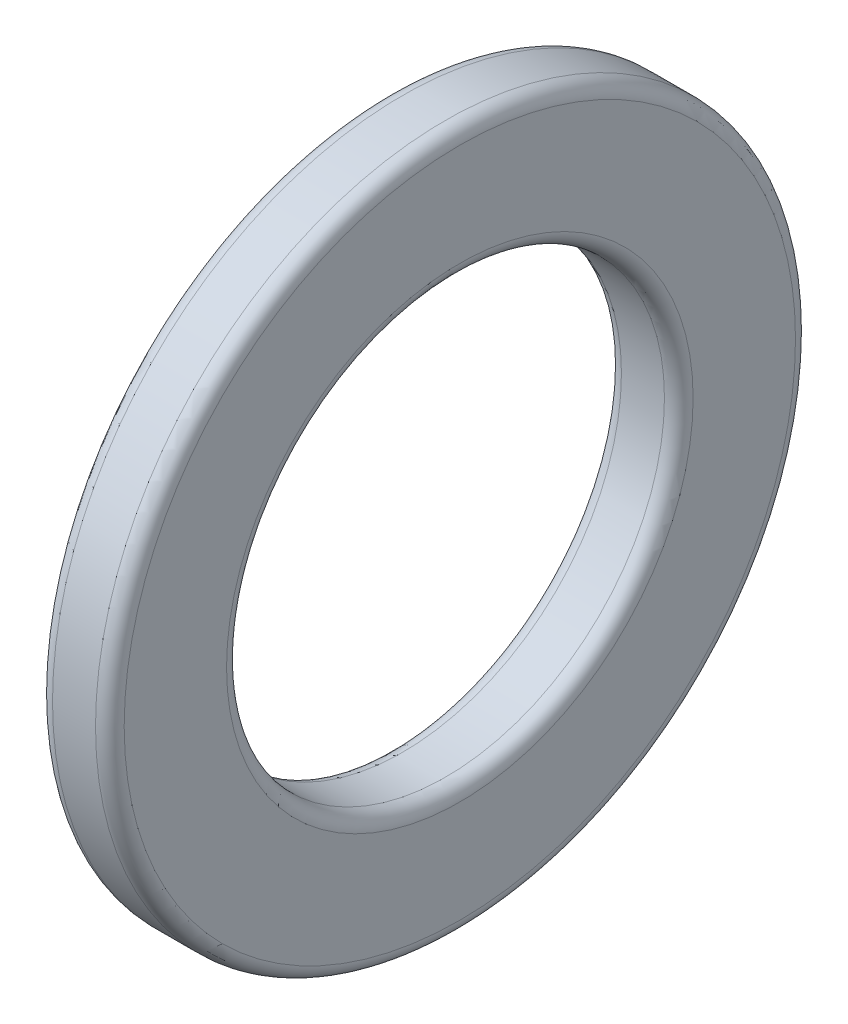
ISO-10303-21;
HEADER;
FILE_DESCRIPTION(('STEP AP214'),'2;1');
FILE_NAME('part.step','',(''),(''),'','','');
FILE_SCHEMA(('AUTOMOTIVE_DESIGN { 1 0 10303 214 1 1 1 1 }'));
ENDSEC;
DATA;
#1=APPLICATION_CONTEXT('core data for automotive mechanical design processes');
#2=APPLICATION_PROTOCOL_DEFINITION('international standard','automotive_design',2000,#1);
#3=PRODUCT_CONTEXT('',#1,'mechanical');
#4=PRODUCT('Part','Part','',(#3));
#5=PRODUCT_RELATED_PRODUCT_CATEGORY('part','',(#4));
#6=PRODUCT_DEFINITION_FORMATION('','',#4);
#7=PRODUCT_DEFINITION_CONTEXT('part definition',#1,'design');
#8=PRODUCT_DEFINITION('design','',#6,#7);
#9=PRODUCT_DEFINITION_SHAPE('','',#8);
#10=(LENGTH_UNIT() NAMED_UNIT(*) SI_UNIT(.MILLI.,.METRE.));
#11=(NAMED_UNIT(*) PLANE_ANGLE_UNIT() SI_UNIT($,.RADIAN.));
#12=(NAMED_UNIT(*) SI_UNIT($,.STERADIAN.) SOLID_ANGLE_UNIT());
#13=UNCERTAINTY_MEASURE_WITH_UNIT(LENGTH_MEASURE(1.E-05),#10,'distance_accuracy_value','');
#14=(GEOMETRIC_REPRESENTATION_CONTEXT(3) GLOBAL_UNCERTAINTY_ASSIGNED_CONTEXT((#13)) GLOBAL_UNIT_ASSIGNED_CONTEXT((#10,
#11,#12)) REPRESENTATION_CONTEXT('',''));
#15=CARTESIAN_POINT('',(0.,0.,0.));
#16=DIRECTION('',(0.,0.,1.));
#17=DIRECTION('',(1.,0.,0.));
#18=AXIS2_PLACEMENT_3D('',#15,#16,#17);
#19=CARTESIAN_POINT('',(0.8128,0.,0.));
#20=DIRECTION('',(1.,0.,0.));
#21=DIRECTION('',(0.,0.,-1.));
#22=AXIS2_PLACEMENT_3D('',#19,#20,#21);
#23=PLANE('',#22);
#24=CARTESIAN_POINT('',(0.8128,0.,0.));
#25=DIRECTION('',(1.,0.,0.));
#26=DIRECTION('',(0.,0.,-1.));
#27=AXIS2_PLACEMENT_3D('',#24,#25,#26);
#28=CIRCLE('',#27,7.61237999999999);
#29=CARTESIAN_POINT('',(0.8128,0.,-7.61237999999999));
#30=VERTEX_POINT('',#29);
#31=EDGE_CURVE('E80',#30,#30,#28,.T.);
#32=ORIENTED_EDGE('',*,*,#31,.T.);
#33=EDGE_LOOP('',(#32));
#34=FACE_BOUND('',#33,.T.);
#35=CARTESIAN_POINT('',(0.8128,0.,0.));
#36=DIRECTION('',(1.,0.,0.));
#37=DIRECTION('',(0.,0.,-1.));
#38=AXIS2_PLACEMENT_3D('',#35,#36,#37);
#39=CIRCLE('',#38,5.29082);
#40=CARTESIAN_POINT('',(0.8128,0.,-5.29082));
#41=VERTEX_POINT('',#40);
#42=EDGE_CURVE('E84',#41,#41,#39,.F.);
#43=ORIENTED_EDGE('',*,*,#42,.T.);
#44=EDGE_LOOP('',(#43));
#45=FACE_BOUND('',#44,.T.);
#46=ADVANCED_FACE('F45',(#34,#45),#23,.T.);
#47=CARTESIAN_POINT('',(-0.8128,0.,0.));
#48=DIRECTION('',(1.,0.,0.));
#49=DIRECTION('',(0.,0.,-1.));
#50=AXIS2_PLACEMENT_3D('',#47,#48,#49);
#51=PLANE('',#50);
#52=CARTESIAN_POINT('',(-0.8128,0.,0.));
#53=DIRECTION('',(1.,0.,0.));
#54=DIRECTION('',(0.,0.,-1.));
#55=AXIS2_PLACEMENT_3D('',#52,#53,#54);
#56=CIRCLE('',#55,7.61237999999999);
#57=CARTESIAN_POINT('',(-0.8128,0.,-7.61237999999999));
#58=VERTEX_POINT('',#57);
#59=EDGE_CURVE('E61',#58,#58,#56,.F.);
#60=ORIENTED_EDGE('',*,*,#59,.T.);
#61=EDGE_LOOP('',(#60));
#62=FACE_BOUND('',#61,.T.);
#63=CARTESIAN_POINT('',(-0.8128,0.,0.));
#64=DIRECTION('',(1.,0.,0.));
#65=DIRECTION('',(0.,0.,-1.));
#66=AXIS2_PLACEMENT_3D('',#63,#64,#65);
#67=CIRCLE('',#66,5.29082);
#68=CARTESIAN_POINT('',(-0.8128,0.,-5.29082));
#69=VERTEX_POINT('',#68);
#70=EDGE_CURVE('E68',#69,#69,#67,.T.);
#71=ORIENTED_EDGE('',*,*,#70,.T.);
#72=EDGE_LOOP('',(#71));
#73=FACE_BOUND('',#72,.T.);
#74=ADVANCED_FACE('F103',(#62,#73),#51,.F.);
#75=CARTESIAN_POINT('',(0.8128,0.,0.));
#76=DIRECTION('',(-1.,0.,0.));
#77=DIRECTION('',(0.,0.,1.));
#78=AXIS2_PLACEMENT_3D('',#75,#76,#77);
#79=CYLINDRICAL_SURFACE('',#78,7.93749999999999);
#80=CARTESIAN_POINT('',(0.48768,0.,0.));
#81=DIRECTION('',(1.,0.,0.));
#82=DIRECTION('',(0.,0.,-1.));
#83=AXIS2_PLACEMENT_3D('',#80,#81,#82);
#84=CIRCLE('',#83,7.93749999999999);
#85=CARTESIAN_POINT('',(0.48768,0.,-7.93749999999999));
#86=VERTEX_POINT('',#85);
#87=EDGE_CURVE('E73',#86,#86,#84,.F.);
#88=ORIENTED_EDGE('',*,*,#87,.T.);
#89=EDGE_LOOP('',(#88));
#90=FACE_BOUND('',#89,.T.);
#91=CARTESIAN_POINT('',(-0.48768,0.,0.));
#92=DIRECTION('',(1.,0.,0.));
#93=DIRECTION('',(0.,0.,-1.));
#94=AXIS2_PLACEMENT_3D('',#91,#92,#93);
#95=CIRCLE('',#94,7.93749999999999);
#96=CARTESIAN_POINT('',(-0.48768,0.,-7.93749999999999));
#97=VERTEX_POINT('',#96);
#98=EDGE_CURVE('E77',#97,#97,#95,.T.);
#99=ORIENTED_EDGE('',*,*,#98,.T.);
#100=EDGE_LOOP('',(#99));
#101=FACE_BOUND('',#100,.T.);
#102=ADVANCED_FACE('F108',(#90,#101),#79,.T.);
#103=CARTESIAN_POINT('',(0.8128,0.,0.));
#104=DIRECTION('',(-1.,0.,0.));
#105=DIRECTION('',(0.,0.,1.));
#106=AXIS2_PLACEMENT_3D('',#103,#104,#105);
#107=CYLINDRICAL_SURFACE('',#106,4.9657);
#108=CARTESIAN_POINT('',(0.48768,0.,0.));
#109=DIRECTION('',(1.,0.,0.));
#110=DIRECTION('',(0.,0.,-1.));
#111=AXIS2_PLACEMENT_3D('',#108,#109,#110);
#112=CIRCLE('',#111,4.9657);
#113=CARTESIAN_POINT('',(0.48768,0.,-4.9657));
#114=VERTEX_POINT('',#113);
#115=EDGE_CURVE('E10',#114,#114,#112,.T.);
#116=ORIENTED_EDGE('',*,*,#115,.T.);
#117=EDGE_LOOP('',(#116));
#118=FACE_BOUND('',#117,.T.);
#119=CARTESIAN_POINT('',(-0.48768,0.,0.));
#120=DIRECTION('',(1.,0.,0.));
#121=DIRECTION('',(0.,0.,-1.));
#122=AXIS2_PLACEMENT_3D('',#119,#120,#121);
#123=CIRCLE('',#122,4.9657);
#124=CARTESIAN_POINT('',(-0.48768,0.,-4.9657));
#125=VERTEX_POINT('',#124);
#126=EDGE_CURVE('E53',#125,#125,#123,.F.);
#127=ORIENTED_EDGE('',*,*,#126,.T.);
#128=EDGE_LOOP('',(#127));
#129=FACE_BOUND('',#128,.T.);
#130=ADVANCED_FACE('F112',(#118,#129),#107,.F.);
#131=CARTESIAN_POINT('',(0.48768,0.,0.));
#132=DIRECTION('',(1.,0.,0.));
#133=DIRECTION('',(0.,0.,-1.));
#134=AXIS2_PLACEMENT_3D('',#131,#132,#133);
#135=TOROIDAL_SURFACE('',#134,7.61237999999999,0.32512);
#136=ORIENTED_EDGE('',*,*,#87,.F.);
#137=EDGE_LOOP('',(#136));
#138=FACE_BOUND('',#137,.T.);
#139=ORIENTED_EDGE('',*,*,#31,.F.);
#140=EDGE_LOOP('',(#139));
#141=FACE_BOUND('',#140,.T.);
#142=ADVANCED_FACE('F100',(#138,#141),#135,.T.);
#143=CARTESIAN_POINT('',(-0.48768,0.,0.));
#144=DIRECTION('',(1.,0.,0.));
#145=DIRECTION('',(0.,0.,-1.));
#146=AXIS2_PLACEMENT_3D('',#143,#144,#145);
#147=TOROIDAL_SURFACE('',#146,7.61237999999999,0.32512);
#148=ORIENTED_EDGE('',*,*,#59,.F.);
#149=EDGE_LOOP('',(#148));
#150=FACE_BOUND('',#149,.T.);
#151=ORIENTED_EDGE('',*,*,#98,.F.);
#152=EDGE_LOOP('',(#151));
#153=FACE_BOUND('',#152,.T.);
#154=ADVANCED_FACE('F93',(#150,#153),#147,.T.);
#155=CARTESIAN_POINT('',(0.48768,0.,0.));
#156=DIRECTION('',(1.,0.,0.));
#157=DIRECTION('',(0.,0.,-1.));
#158=AXIS2_PLACEMENT_3D('',#155,#156,#157);
#159=TOROIDAL_SURFACE('',#158,5.29082,0.32512);
#160=ORIENTED_EDGE('',*,*,#42,.F.);
#161=EDGE_LOOP('',(#160));
#162=FACE_BOUND('',#161,.T.);
#163=ORIENTED_EDGE('',*,*,#115,.F.);
#164=EDGE_LOOP('',(#163));
#165=FACE_BOUND('',#164,.T.);
#166=ADVANCED_FACE('F90',(#162,#165),#159,.T.);
#167=CARTESIAN_POINT('',(-0.48768,0.,0.));
#168=DIRECTION('',(1.,0.,0.));
#169=DIRECTION('',(0.,0.,-1.));
#170=AXIS2_PLACEMENT_3D('',#167,#168,#169);
#171=TOROIDAL_SURFACE('',#170,5.29082,0.32512);
#172=ORIENTED_EDGE('',*,*,#126,.F.);
#173=EDGE_LOOP('',(#172));
#174=FACE_BOUND('',#173,.T.);
#175=ORIENTED_EDGE('',*,*,#70,.F.);
#176=EDGE_LOOP('',(#175));
#177=FACE_BOUND('',#176,.T.);
#178=ADVANCED_FACE('F47',(#174,#177),#171,.T.);
#179=CLOSED_SHELL('',(#46,#74,#102,#130,#142,#154,#166,#178));
#180=MANIFOLD_SOLID_BREP('B2',#179);
#181=ADVANCED_BREP_SHAPE_REPRESENTATION('',(#18,#180),#14);
#182=SHAPE_DEFINITION_REPRESENTATION(#9,#181);
ENDSEC;
END-ISO-10303-21;
